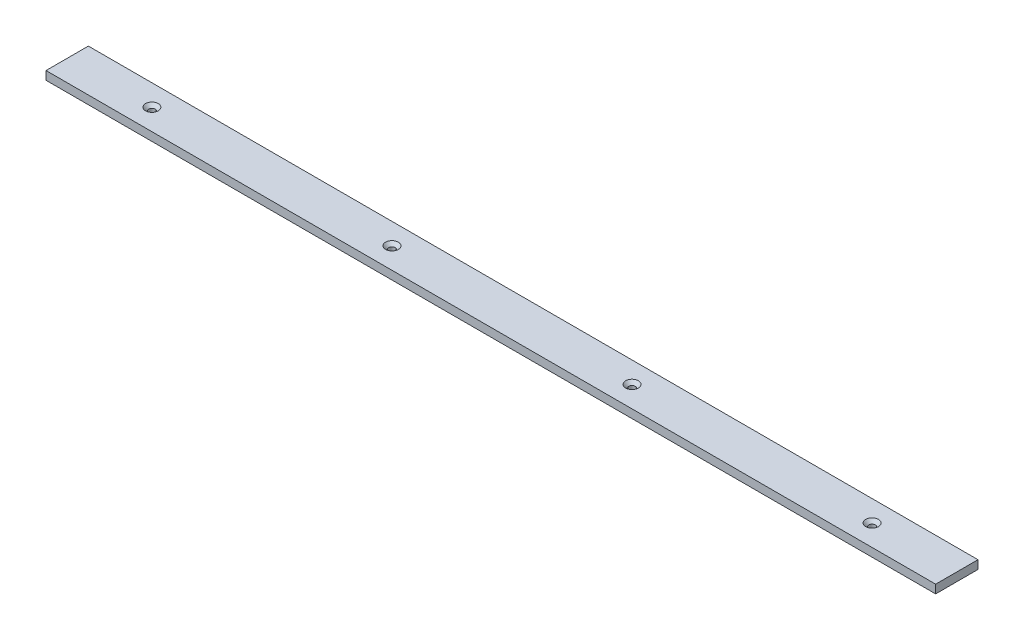
ISO-10303-21;
HEADER;
FILE_DESCRIPTION(('STEP AP214'),'2;1');
FILE_NAME('part.step','',(''),(''),'','','');
FILE_SCHEMA(('AUTOMOTIVE_DESIGN { 1 0 10303 214 1 1 1 1 }'));
ENDSEC;
DATA;
#1=APPLICATION_CONTEXT('core data for automotive mechanical design processes');
#2=APPLICATION_PROTOCOL_DEFINITION('international standard','automotive_design',2000,#1);
#3=PRODUCT_CONTEXT('',#1,'mechanical');
#4=PRODUCT('Part','Part','',(#3));
#5=PRODUCT_RELATED_PRODUCT_CATEGORY('part','',(#4));
#6=PRODUCT_DEFINITION_FORMATION('','',#4);
#7=PRODUCT_DEFINITION_CONTEXT('part definition',#1,'design');
#8=PRODUCT_DEFINITION('design','',#6,#7);
#9=PRODUCT_DEFINITION_SHAPE('','',#8);
#10=(LENGTH_UNIT() NAMED_UNIT(*) SI_UNIT(.MILLI.,.METRE.));
#11=(NAMED_UNIT(*) PLANE_ANGLE_UNIT() SI_UNIT($,.RADIAN.));
#12=(NAMED_UNIT(*) SI_UNIT($,.STERADIAN.) SOLID_ANGLE_UNIT());
#13=UNCERTAINTY_MEASURE_WITH_UNIT(LENGTH_MEASURE(1.E-05),#10,'distance_accuracy_value','');
#14=(GEOMETRIC_REPRESENTATION_CONTEXT(3) GLOBAL_UNCERTAINTY_ASSIGNED_CONTEXT((#13)) GLOBAL_UNIT_ASSIGNED_CONTEXT((#10,
#11,#12)) REPRESENTATION_CONTEXT('',''));
#15=CARTESIAN_POINT('',(0.,0.,0.));
#16=DIRECTION('',(0.,0.,1.));
#17=DIRECTION('',(1.,0.,0.));
#18=AXIS2_PLACEMENT_3D('',#15,#16,#17);
#19=CARTESIAN_POINT('',(-315.,6.,-15.));
#20=DIRECTION('',(1.,0.,0.));
#21=DIRECTION('',(0.,0.,-1.));
#22=AXIS2_PLACEMENT_3D('',#19,#20,#21);
#23=PLANE('',#22);
#24=DIRECTION('',(0.,0.,1.));
#25=VECTOR('',#24,1.);
#26=CARTESIAN_POINT('',(-315.,0.,-15.));
#27=LINE('',#26,#25);
#28=CARTESIAN_POINT('',(-315.,0.,-15.));
#29=VERTEX_POINT('',#28);
#30=CARTESIAN_POINT('',(-315.,0.,15.));
#31=VERTEX_POINT('',#30);
#32=EDGE_CURVE('E100',#29,#31,#27,.T.);
#33=ORIENTED_EDGE('',*,*,#32,.T.);
#34=DIRECTION('',(0.,-1.,0.));
#35=VECTOR('',#34,1.);
#36=CARTESIAN_POINT('',(-315.,6.,15.));
#37=LINE('',#36,#35);
#38=CARTESIAN_POINT('',(-315.,6.,15.));
#39=VERTEX_POINT('',#38);
#40=EDGE_CURVE('E11',#39,#31,#37,.T.);
#41=ORIENTED_EDGE('',*,*,#40,.F.);
#42=DIRECTION('',(0.,0.,1.));
#43=VECTOR('',#42,1.);
#44=CARTESIAN_POINT('',(-315.,6.,-15.));
#45=LINE('',#44,#43);
#46=CARTESIAN_POINT('',(-315.,6.,-15.));
#47=VERTEX_POINT('',#46);
#48=EDGE_CURVE('E87',#47,#39,#45,.T.);
#49=ORIENTED_EDGE('',*,*,#48,.F.);
#50=DIRECTION('',(0.,-1.,0.));
#51=VECTOR('',#50,1.);
#52=CARTESIAN_POINT('',(-315.,6.,-15.));
#53=LINE('',#52,#51);
#54=EDGE_CURVE('E96',#47,#29,#53,.T.);
#55=ORIENTED_EDGE('',*,*,#54,.T.);
#56=EDGE_LOOP('',(#33,#41,#49,#55));
#57=FACE_BOUND('',#56,.T.);
#58=ADVANCED_FACE('F34',(#57),#23,.F.);
#59=CARTESIAN_POINT('',(-315.,6.,15.));
#60=DIRECTION('',(0.,0.,-1.));
#61=DIRECTION('',(-1.,0.,0.));
#62=AXIS2_PLACEMENT_3D('',#59,#60,#61);
#63=PLANE('',#62);
#64=DIRECTION('',(1.,0.,0.));
#65=VECTOR('',#64,1.);
#66=CARTESIAN_POINT('',(-315.,0.,15.));
#67=LINE('',#66,#65);
#68=CARTESIAN_POINT('',(315.,0.,15.));
#69=VERTEX_POINT('',#68);
#70=EDGE_CURVE('E91',#31,#69,#67,.T.);
#71=ORIENTED_EDGE('',*,*,#70,.T.);
#72=DIRECTION('',(0.,-1.,0.));
#73=VECTOR('',#72,1.);
#74=CARTESIAN_POINT('',(315.,6.,15.));
#75=LINE('',#74,#73);
#76=CARTESIAN_POINT('',(315.,6.,15.));
#77=VERTEX_POINT('',#76);
#78=EDGE_CURVE('E43',#77,#69,#75,.T.);
#79=ORIENTED_EDGE('',*,*,#78,.F.);
#80=DIRECTION('',(1.,0.,0.));
#81=VECTOR('',#80,1.);
#82=CARTESIAN_POINT('',(-315.,6.,15.));
#83=LINE('',#82,#81);
#84=EDGE_CURVE('E82',#39,#77,#83,.T.);
#85=ORIENTED_EDGE('',*,*,#84,.F.);
#86=ORIENTED_EDGE('',*,*,#40,.T.);
#87=EDGE_LOOP('',(#71,#79,#85,#86));
#88=FACE_BOUND('',#87,.T.);
#89=ADVANCED_FACE('F90',(#88),#63,.F.);
#90=CARTESIAN_POINT('',(315.,6.,-15.));
#91=DIRECTION('',(-1.,0.,0.));
#92=DIRECTION('',(0.,0.,1.));
#93=AXIS2_PLACEMENT_3D('',#90,#91,#92);
#94=PLANE('',#93);
#95=DIRECTION('',(0.,0.,-1.));
#96=VECTOR('',#95,1.);
#97=CARTESIAN_POINT('',(315.,0.,-15.));
#98=LINE('',#97,#96);
#99=CARTESIAN_POINT('',(315.,0.,-15.));
#100=VERTEX_POINT('',#99);
#101=EDGE_CURVE('E69',#69,#100,#98,.T.);
#102=ORIENTED_EDGE('',*,*,#101,.T.);
#103=DIRECTION('',(0.,-1.,0.));
#104=VECTOR('',#103,1.);
#105=CARTESIAN_POINT('',(315.,6.,-15.));
#106=LINE('',#105,#104);
#107=CARTESIAN_POINT('',(315.,6.,-15.));
#108=VERTEX_POINT('',#107);
#109=EDGE_CURVE('E92',#108,#100,#106,.T.);
#110=ORIENTED_EDGE('',*,*,#109,.F.);
#111=DIRECTION('',(0.,0.,-1.));
#112=VECTOR('',#111,1.);
#113=CARTESIAN_POINT('',(315.,6.,-15.));
#114=LINE('',#113,#112);
#115=EDGE_CURVE('E85',#77,#108,#114,.T.);
#116=ORIENTED_EDGE('',*,*,#115,.F.);
#117=ORIENTED_EDGE('',*,*,#78,.T.);
#118=EDGE_LOOP('',(#102,#110,#116,#117));
#119=FACE_BOUND('',#118,.T.);
#120=ADVANCED_FACE('F94',(#119),#94,.F.);
#121=CARTESIAN_POINT('',(-315.,6.,-15.));
#122=DIRECTION('',(0.,0.,1.));
#123=DIRECTION('',(1.,0.,0.));
#124=AXIS2_PLACEMENT_3D('',#121,#122,#123);
#125=PLANE('',#124);
#126=DIRECTION('',(-1.,0.,0.));
#127=VECTOR('',#126,1.);
#128=CARTESIAN_POINT('',(-315.,0.,-15.));
#129=LINE('',#128,#127);
#130=EDGE_CURVE('E75',#100,#29,#129,.T.);
#131=ORIENTED_EDGE('',*,*,#130,.T.);
#132=ORIENTED_EDGE('',*,*,#54,.F.);
#133=DIRECTION('',(-1.,0.,0.));
#134=VECTOR('',#133,1.);
#135=CARTESIAN_POINT('',(-315.,6.,-15.));
#136=LINE('',#135,#134);
#137=EDGE_CURVE('E52',#108,#47,#136,.T.);
#138=ORIENTED_EDGE('',*,*,#137,.F.);
#139=ORIENTED_EDGE('',*,*,#109,.T.);
#140=EDGE_LOOP('',(#131,#132,#138,#139));
#141=FACE_BOUND('',#140,.T.);
#142=ADVANCED_FACE('F169',(#141),#125,.F.);
#143=CARTESIAN_POINT('',(0.,6.,0.));
#144=DIRECTION('',(0.,1.,0.));
#145=DIRECTION('',(0.,0.,1.));
#146=AXIS2_PLACEMENT_3D('',#143,#144,#145);
#147=PLANE('',#146);
#148=CARTESIAN_POINT('',(255.,6.,0.));
#149=DIRECTION('',(0.,1.,0.));
#150=DIRECTION('',(0.,0.,1.));
#151=AXIS2_PLACEMENT_3D('',#148,#149,#150);
#152=CIRCLE('',#151,4.50000000000002);
#153=CARTESIAN_POINT('',(255.,6.,4.50000000000002));
#154=VERTEX_POINT('',#153);
#155=EDGE_CURVE('E129',#154,#154,#152,.T.);
#156=ORIENTED_EDGE('',*,*,#155,.F.);
#157=EDGE_LOOP('',(#156));
#158=FACE_BOUND('',#157,.T.);
#159=CARTESIAN_POINT('',(85.,6.,0.));
#160=DIRECTION('',(0.,1.,0.));
#161=DIRECTION('',(0.,0.,1.));
#162=AXIS2_PLACEMENT_3D('',#159,#160,#161);
#163=CIRCLE('',#162,4.50000000000002);
#164=CARTESIAN_POINT('',(85.,6.,4.50000000000002));
#165=VERTEX_POINT('',#164);
#166=EDGE_CURVE('E119',#165,#165,#163,.T.);
#167=ORIENTED_EDGE('',*,*,#166,.F.);
#168=EDGE_LOOP('',(#167));
#169=FACE_BOUND('',#168,.T.);
#170=CARTESIAN_POINT('',(-85.,6.,0.));
#171=DIRECTION('',(0.,1.,0.));
#172=DIRECTION('',(0.,0.,1.));
#173=AXIS2_PLACEMENT_3D('',#170,#171,#172);
#174=CIRCLE('',#173,4.50000000000002);
#175=CARTESIAN_POINT('',(-85.,6.,4.50000000000002));
#176=VERTEX_POINT('',#175);
#177=EDGE_CURVE('E116',#176,#176,#174,.T.);
#178=ORIENTED_EDGE('',*,*,#177,.F.);
#179=EDGE_LOOP('',(#178));
#180=FACE_BOUND('',#179,.T.);
#181=CARTESIAN_POINT('',(-255.,6.,0.));
#182=DIRECTION('',(0.,1.,0.));
#183=DIRECTION('',(0.,0.,1.));
#184=AXIS2_PLACEMENT_3D('',#181,#182,#183);
#185=CIRCLE('',#184,4.50000000000002);
#186=CARTESIAN_POINT('',(-255.,6.,4.50000000000002));
#187=VERTEX_POINT('',#186);
#188=EDGE_CURVE('E112',#187,#187,#185,.T.);
#189=ORIENTED_EDGE('',*,*,#188,.F.);
#190=EDGE_LOOP('',(#189));
#191=FACE_BOUND('',#190,.T.);
#192=ORIENTED_EDGE('',*,*,#48,.T.);
#193=ORIENTED_EDGE('',*,*,#84,.T.);
#194=ORIENTED_EDGE('',*,*,#115,.T.);
#195=ORIENTED_EDGE('',*,*,#137,.T.);
#196=EDGE_LOOP('',(#192,#193,#194,#195));
#197=FACE_BOUND('',#196,.T.);
#198=ADVANCED_FACE('F83',(#158,#169,#180,#191,#197),#147,.T.);
#199=CARTESIAN_POINT('',(0.,0.,0.));
#200=DIRECTION('',(0.,1.,0.));
#201=DIRECTION('',(0.,0.,1.));
#202=AXIS2_PLACEMENT_3D('',#199,#200,#201);
#203=PLANE('',#202);
#204=CARTESIAN_POINT('',(255.,0.,0.));
#205=DIRECTION('',(0.,1.,0.));
#206=DIRECTION('',(0.,0.,1.));
#207=AXIS2_PLACEMENT_3D('',#204,#205,#206);
#208=CIRCLE('',#207,2.24999999999995);
#209=CARTESIAN_POINT('',(255.,0.,2.24999999999995));
#210=VERTEX_POINT('',#209);
#211=EDGE_CURVE('E115',#210,#210,#208,.T.);
#212=ORIENTED_EDGE('',*,*,#211,.T.);
#213=EDGE_LOOP('',(#212));
#214=FACE_BOUND('',#213,.T.);
#215=CARTESIAN_POINT('',(85.,0.,0.));
#216=DIRECTION('',(0.,1.,0.));
#217=DIRECTION('',(0.,0.,1.));
#218=AXIS2_PLACEMENT_3D('',#215,#216,#217);
#219=CIRCLE('',#218,2.24999999999995);
#220=CARTESIAN_POINT('',(85.,0.,2.24999999999995));
#221=VERTEX_POINT('',#220);
#222=EDGE_CURVE('E134',#221,#221,#219,.T.);
#223=ORIENTED_EDGE('',*,*,#222,.T.);
#224=EDGE_LOOP('',(#223));
#225=FACE_BOUND('',#224,.T.);
#226=CARTESIAN_POINT('',(-85.,0.,0.));
#227=DIRECTION('',(0.,1.,0.));
#228=DIRECTION('',(0.,0.,1.));
#229=AXIS2_PLACEMENT_3D('',#226,#227,#228);
#230=CIRCLE('',#229,2.24999999999995);
#231=CARTESIAN_POINT('',(-85.,0.,2.24999999999995));
#232=VERTEX_POINT('',#231);
#233=EDGE_CURVE('E137',#232,#232,#230,.T.);
#234=ORIENTED_EDGE('',*,*,#233,.T.);
#235=EDGE_LOOP('',(#234));
#236=FACE_BOUND('',#235,.T.);
#237=CARTESIAN_POINT('',(-255.,0.,0.));
#238=DIRECTION('',(0.,1.,0.));
#239=DIRECTION('',(0.,0.,1.));
#240=AXIS2_PLACEMENT_3D('',#237,#238,#239);
#241=CIRCLE('',#240,2.24999999999995);
#242=CARTESIAN_POINT('',(-255.,0.,2.24999999999995));
#243=VERTEX_POINT('',#242);
#244=EDGE_CURVE('E103',#243,#243,#241,.T.);
#245=ORIENTED_EDGE('',*,*,#244,.T.);
#246=EDGE_LOOP('',(#245));
#247=FACE_BOUND('',#246,.T.);
#248=ORIENTED_EDGE('',*,*,#32,.F.);
#249=ORIENTED_EDGE('',*,*,#130,.F.);
#250=ORIENTED_EDGE('',*,*,#101,.F.);
#251=ORIENTED_EDGE('',*,*,#70,.F.);
#252=EDGE_LOOP('',(#248,#249,#250,#251));
#253=FACE_BOUND('',#252,.T.);
#254=ADVANCED_FACE('F145',(#214,#225,#236,#247,#253),#203,.F.);
#255=CARTESIAN_POINT('',(-255.,0.,0.));
#256=DIRECTION('',(0.,1.,0.));
#257=DIRECTION('',(0.,0.,1.));
#258=AXIS2_PLACEMENT_3D('',#255,#256,#257);
#259=CYLINDRICAL_SURFACE('',#258,2.24999999999995);
#260=CARTESIAN_POINT('',(-255.,3.74999999999994,0.));
#261=DIRECTION('',(0.,1.,0.));
#262=DIRECTION('',(0.,0.,1.));
#263=AXIS2_PLACEMENT_3D('',#260,#261,#262);
#264=CIRCLE('',#263,2.24999999999995);
#265=CARTESIAN_POINT('',(-255.,3.74999999999994,2.24999999999995));
#266=VERTEX_POINT('',#265);
#267=EDGE_CURVE('E109',#266,#266,#264,.T.);
#268=ORIENTED_EDGE('',*,*,#267,.T.);
#269=EDGE_LOOP('',(#268));
#270=FACE_BOUND('',#269,.T.);
#271=ORIENTED_EDGE('',*,*,#244,.F.);
#272=EDGE_LOOP('',(#271));
#273=FACE_BOUND('',#272,.T.);
#274=ADVANCED_FACE('F148',(#270,#273),#259,.F.);
#275=CARTESIAN_POINT('',(-255.,6.,0.));
#276=DIRECTION('',(0.,1.,0.));
#277=DIRECTION('',(0.,0.,1.));
#278=AXIS2_PLACEMENT_3D('',#275,#276,#277);
#279=CONICAL_SURFACE('',#278,4.50000000000002,0.78539816339745);
#280=ORIENTED_EDGE('',*,*,#188,.T.);
#281=EDGE_LOOP('',(#280));
#282=FACE_BOUND('',#281,.T.);
#283=ORIENTED_EDGE('',*,*,#267,.F.);
#284=EDGE_LOOP('',(#283));
#285=FACE_BOUND('',#284,.T.);
#286=ADVANCED_FACE('F150',(#282,#285),#279,.F.);
#287=CARTESIAN_POINT('',(-85.,0.,0.));
#288=DIRECTION('',(0.,1.,0.));
#289=DIRECTION('',(0.,0.,1.));
#290=AXIS2_PLACEMENT_3D('',#287,#288,#289);
#291=CYLINDRICAL_SURFACE('',#290,2.24999999999995);
#292=CARTESIAN_POINT('',(-85.,3.74999999999994,0.));
#293=DIRECTION('',(0.,1.,0.));
#294=DIRECTION('',(0.,0.,1.));
#295=AXIS2_PLACEMENT_3D('',#292,#293,#294);
#296=CIRCLE('',#295,2.24999999999995);
#297=CARTESIAN_POINT('',(-85.,3.74999999999994,2.24999999999995));
#298=VERTEX_POINT('',#297);
#299=EDGE_CURVE('E113',#298,#298,#296,.T.);
#300=ORIENTED_EDGE('',*,*,#299,.T.);
#301=EDGE_LOOP('',(#300));
#302=FACE_BOUND('',#301,.T.);
#303=ORIENTED_EDGE('',*,*,#233,.F.);
#304=EDGE_LOOP('',(#303));
#305=FACE_BOUND('',#304,.T.);
#306=ADVANCED_FACE('F157',(#302,#305),#291,.F.);
#307=CARTESIAN_POINT('',(85.,0.,0.));
#308=DIRECTION('',(0.,1.,0.));
#309=DIRECTION('',(0.,0.,1.));
#310=AXIS2_PLACEMENT_3D('',#307,#308,#309);
#311=CYLINDRICAL_SURFACE('',#310,2.24999999999995);
#312=CARTESIAN_POINT('',(85.,3.74999999999994,0.));
#313=DIRECTION('',(0.,1.,0.));
#314=DIRECTION('',(0.,0.,1.));
#315=AXIS2_PLACEMENT_3D('',#312,#313,#314);
#316=CIRCLE('',#315,2.24999999999995);
#317=CARTESIAN_POINT('',(85.,3.74999999999994,2.24999999999995));
#318=VERTEX_POINT('',#317);
#319=EDGE_CURVE('E117',#318,#318,#316,.T.);
#320=ORIENTED_EDGE('',*,*,#319,.T.);
#321=EDGE_LOOP('',(#320));
#322=FACE_BOUND('',#321,.T.);
#323=ORIENTED_EDGE('',*,*,#222,.F.);
#324=EDGE_LOOP('',(#323));
#325=FACE_BOUND('',#324,.T.);
#326=ADVANCED_FACE('F223',(#322,#325),#311,.F.);
#327=CARTESIAN_POINT('',(255.,0.,0.));
#328=DIRECTION('',(0.,1.,0.));
#329=DIRECTION('',(0.,0.,1.));
#330=AXIS2_PLACEMENT_3D('',#327,#328,#329);
#331=CYLINDRICAL_SURFACE('',#330,2.24999999999995);
#332=CARTESIAN_POINT('',(255.,3.74999999999994,0.));
#333=DIRECTION('',(0.,1.,0.));
#334=DIRECTION('',(0.,0.,1.));
#335=AXIS2_PLACEMENT_3D('',#332,#333,#334);
#336=CIRCLE('',#335,2.24999999999995);
#337=CARTESIAN_POINT('',(255.,3.74999999999994,2.24999999999995));
#338=VERTEX_POINT('',#337);
#339=EDGE_CURVE('E37',#338,#338,#336,.T.);
#340=ORIENTED_EDGE('',*,*,#339,.T.);
#341=EDGE_LOOP('',(#340));
#342=FACE_BOUND('',#341,.T.);
#343=ORIENTED_EDGE('',*,*,#211,.F.);
#344=EDGE_LOOP('',(#343));
#345=FACE_BOUND('',#344,.T.);
#346=ADVANCED_FACE('F232',(#342,#345),#331,.F.);
#347=CARTESIAN_POINT('',(-85.,6.,0.));
#348=DIRECTION('',(0.,1.,0.));
#349=DIRECTION('',(0.,0.,1.));
#350=AXIS2_PLACEMENT_3D('',#347,#348,#349);
#351=CONICAL_SURFACE('',#350,4.50000000000002,0.78539816339745);
#352=ORIENTED_EDGE('',*,*,#177,.T.);
#353=EDGE_LOOP('',(#352));
#354=FACE_BOUND('',#353,.T.);
#355=ORIENTED_EDGE('',*,*,#299,.F.);
#356=EDGE_LOOP('',(#355));
#357=FACE_BOUND('',#356,.T.);
#358=ADVANCED_FACE('F240',(#354,#357),#351,.F.);
#359=CARTESIAN_POINT('',(85.,6.,0.));
#360=DIRECTION('',(0.,1.,0.));
#361=DIRECTION('',(0.,0.,1.));
#362=AXIS2_PLACEMENT_3D('',#359,#360,#361);
#363=CONICAL_SURFACE('',#362,4.50000000000002,0.78539816339745);
#364=ORIENTED_EDGE('',*,*,#166,.T.);
#365=EDGE_LOOP('',(#364));
#366=FACE_BOUND('',#365,.T.);
#367=ORIENTED_EDGE('',*,*,#319,.F.);
#368=EDGE_LOOP('',(#367));
#369=FACE_BOUND('',#368,.T.);
#370=ADVANCED_FACE('F249',(#366,#369),#363,.F.);
#371=CARTESIAN_POINT('',(255.,6.,0.));
#372=DIRECTION('',(0.,1.,0.));
#373=DIRECTION('',(0.,0.,1.));
#374=AXIS2_PLACEMENT_3D('',#371,#372,#373);
#375=CONICAL_SURFACE('',#374,4.50000000000002,0.78539816339745);
#376=ORIENTED_EDGE('',*,*,#155,.T.);
#377=EDGE_LOOP('',(#376));
#378=FACE_BOUND('',#377,.T.);
#379=ORIENTED_EDGE('',*,*,#339,.F.);
#380=EDGE_LOOP('',(#379));
#381=FACE_BOUND('',#380,.T.);
#382=ADVANCED_FACE('F258',(#378,#381),#375,.F.);
#383=CLOSED_SHELL('',(#58,#89,#120,#142,#198,#254,#274,#286,#306,#326,#346,#358,#370,#382));
#384=MANIFOLD_SOLID_BREP('B2',#383);
#385=ADVANCED_BREP_SHAPE_REPRESENTATION('',(#18,#384),#14);
#386=SHAPE_DEFINITION_REPRESENTATION(#9,#385);
ENDSEC;
END-ISO-10303-21;
